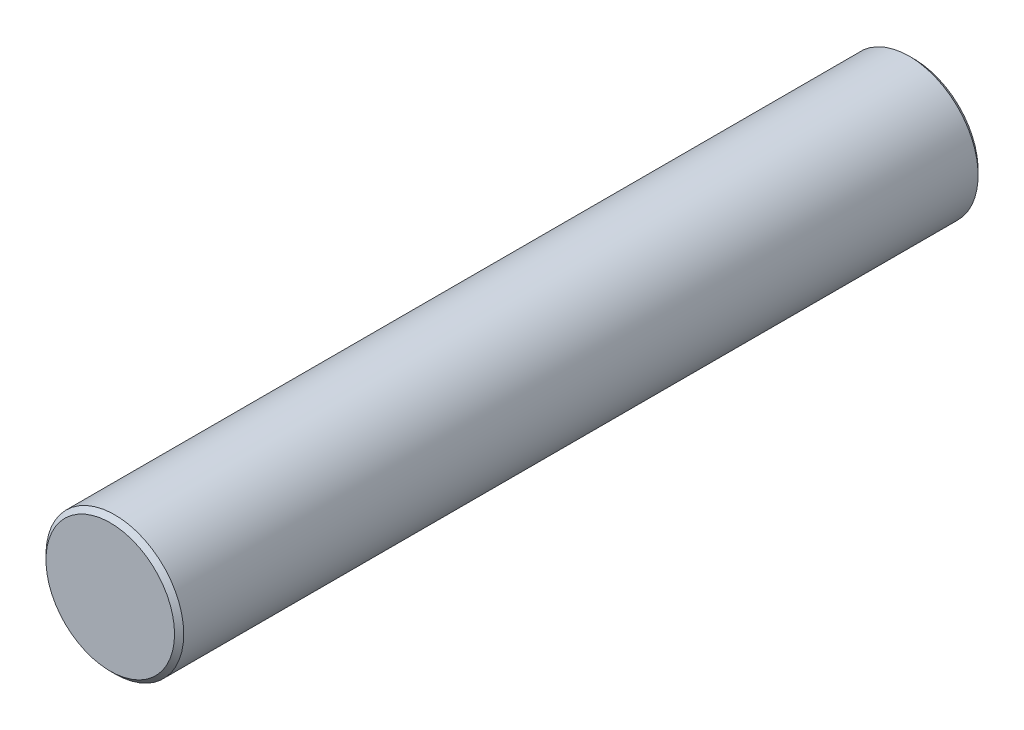
ISO-10303-21;
HEADER;
FILE_DESCRIPTION(('STEP AP214'),'2;1');
FILE_NAME('part.step','',(''),(''),'','','');
FILE_SCHEMA(('AUTOMOTIVE_DESIGN { 1 0 10303 214 1 1 1 1 }'));
ENDSEC;
DATA;
#1=APPLICATION_CONTEXT('core data for automotive mechanical design processes');
#2=APPLICATION_PROTOCOL_DEFINITION('international standard','automotive_design',2000,#1);
#3=PRODUCT_CONTEXT('',#1,'mechanical');
#4=PRODUCT('Part','Part','',(#3));
#5=PRODUCT_RELATED_PRODUCT_CATEGORY('part','',(#4));
#6=PRODUCT_DEFINITION_FORMATION('','',#4);
#7=PRODUCT_DEFINITION_CONTEXT('part definition',#1,'design');
#8=PRODUCT_DEFINITION('design','',#6,#7);
#9=PRODUCT_DEFINITION_SHAPE('','',#8);
#10=(LENGTH_UNIT() NAMED_UNIT(*) SI_UNIT(.MILLI.,.METRE.));
#11=(NAMED_UNIT(*) PLANE_ANGLE_UNIT() SI_UNIT($,.RADIAN.));
#12=(NAMED_UNIT(*) SI_UNIT($,.STERADIAN.) SOLID_ANGLE_UNIT());
#13=UNCERTAINTY_MEASURE_WITH_UNIT(LENGTH_MEASURE(1.E-05),#10,'distance_accuracy_value','');
#14=(GEOMETRIC_REPRESENTATION_CONTEXT(3) GLOBAL_UNCERTAINTY_ASSIGNED_CONTEXT((#13)) GLOBAL_UNIT_ASSIGNED_CONTEXT((#10,
#11,#12)) REPRESENTATION_CONTEXT('',''));
#15=CARTESIAN_POINT('',(0.,0.,0.));
#16=DIRECTION('',(0.,0.,1.));
#17=DIRECTION('',(1.,0.,0.));
#18=AXIS2_PLACEMENT_3D('',#15,#16,#17);
#19=CARTESIAN_POINT('',(0.,0.,35.));
#20=DIRECTION('',(0.,0.,-1.));
#21=DIRECTION('',(-1.,0.,0.));
#22=AXIS2_PLACEMENT_3D('',#19,#20,#21);
#23=CYLINDRICAL_SURFACE('',#22,3.);
#24=CARTESIAN_POINT('',(0.,0.,34.8));
#25=DIRECTION('',(0.,0.,1.));
#26=DIRECTION('',(1.,0.,0.));
#27=AXIS2_PLACEMENT_3D('',#24,#25,#26);
#28=CIRCLE('',#27,3.);
#29=CARTESIAN_POINT('',(3.,0.,34.8));
#30=VERTEX_POINT('',#29);
#31=EDGE_CURVE('E110',#30,#30,#28,.F.);
#32=ORIENTED_EDGE('',*,*,#31,.T.);
#33=EDGE_LOOP('',(#32));
#34=FACE_BOUND('',#33,.T.);
#35=CARTESIAN_POINT('',(0.,0.,10.2));
#36=DIRECTION('',(0.,0.,1.));
#37=DIRECTION('',(1.,0.,0.));
#38=AXIS2_PLACEMENT_3D('',#35,#36,#37);
#39=CIRCLE('',#38,3.);
#40=CARTESIAN_POINT('',(-2.,2.23606797749979,10.2));
#41=VERTEX_POINT('',#40);
#42=CARTESIAN_POINT('',(-2.,-2.23606797749979,10.2));
#43=VERTEX_POINT('',#42);
#44=EDGE_CURVE('E93',#41,#43,#39,.T.);
#45=ORIENTED_EDGE('',*,*,#44,.T.);
#46=DIRECTION('',(0.,0.,-1.));
#47=VECTOR('',#46,1.);
#48=CARTESIAN_POINT('',(-2.,-2.23606797749979,35.));
#49=LINE('',#48,#47);
#50=CARTESIAN_POINT('',(-2.,-2.23606797749979,0.199999999999999));
#51=VERTEX_POINT('',#50);
#52=EDGE_CURVE('E89',#51,#43,#49,.F.);
#53=ORIENTED_EDGE('',*,*,#52,.F.);
#54=CARTESIAN_POINT('',(0.,0.,0.199999999999999));
#55=DIRECTION('',(0.,0.,1.));
#56=DIRECTION('',(1.,0.,0.));
#57=AXIS2_PLACEMENT_3D('',#54,#55,#56);
#58=CIRCLE('',#57,3.);
#59=CARTESIAN_POINT('',(-2.,2.23606797749979,0.199999999999999));
#60=VERTEX_POINT('',#59);
#61=EDGE_CURVE('E85',#51,#60,#58,.T.);
#62=ORIENTED_EDGE('',*,*,#61,.T.);
#63=DIRECTION('',(0.,0.,-1.));
#64=VECTOR('',#63,1.);
#65=CARTESIAN_POINT('',(-2.,2.23606797749979,35.));
#66=LINE('',#65,#64);
#67=EDGE_CURVE('E88',#41,#60,#66,.T.);
#68=ORIENTED_EDGE('',*,*,#67,.F.);
#69=EDGE_LOOP('',(#45,#53,#62,#68));
#70=FACE_BOUND('',#69,.T.);
#71=ADVANCED_FACE('F37',(#34,#70),#23,.T.);
#72=CARTESIAN_POINT('',(0.,0.,0.));
#73=DIRECTION('',(0.,0.,1.));
#74=DIRECTION('',(1.,0.,0.));
#75=AXIS2_PLACEMENT_3D('',#72,#73,#74);
#76=PLANE('',#75);
#77=CARTESIAN_POINT('',(0.,0.,0.));
#78=DIRECTION('',(0.,0.,-1.));
#79=DIRECTION('',(-1.,0.,0.));
#80=AXIS2_PLACEMENT_3D('',#77,#78,#79);
#81=CIRCLE('',#80,0.3);
#82=CARTESIAN_POINT('',(-0.3,0.,0.));
#83=VERTEX_POINT('',#82);
#84=EDGE_CURVE('E172',#83,#83,#81,.T.);
#85=ORIENTED_EDGE('',*,*,#84,.F.);
#86=EDGE_LOOP('',(#85));
#87=FACE_BOUND('',#86,.T.);
#88=CARTESIAN_POINT('',(0.,0.,0.));
#89=DIRECTION('',(0.,0.,1.));
#90=DIRECTION('',(1.,0.,0.));
#91=AXIS2_PLACEMENT_3D('',#88,#89,#90);
#92=CIRCLE('',#91,2.8);
#93=CARTESIAN_POINT('',(-1.8,2.14476105895273,0.));
#94=VERTEX_POINT('',#93);
#95=CARTESIAN_POINT('',(-1.8,-2.14476105895273,0.));
#96=VERTEX_POINT('',#95);
#97=EDGE_CURVE('E58',#94,#96,#92,.F.);
#98=ORIENTED_EDGE('',*,*,#97,.T.);
#99=DIRECTION('',(0.,1.,0.));
#100=VECTOR('',#99,1.);
#101=CARTESIAN_POINT('',(-1.8,2.23606797749979,0.));
#102=LINE('',#101,#100);
#103=EDGE_CURVE('E108',#96,#94,#102,.T.);
#104=ORIENTED_EDGE('',*,*,#103,.T.);
#105=EDGE_LOOP('',(#98,#104));
#106=FACE_BOUND('',#105,.T.);
#107=ADVANCED_FACE('F143',(#87,#106),#76,.F.);
#108=CARTESIAN_POINT('',(0.,0.,35.));
#109=DIRECTION('',(0.,0.,1.));
#110=DIRECTION('',(1.,0.,0.));
#111=AXIS2_PLACEMENT_3D('',#108,#109,#110);
#112=PLANE('',#111);
#113=CARTESIAN_POINT('',(0.,0.,35.));
#114=DIRECTION('',(0.,0.,1.));
#115=DIRECTION('',(1.,0.,0.));
#116=AXIS2_PLACEMENT_3D('',#113,#114,#115);
#117=CIRCLE('',#116,2.8);
#118=CARTESIAN_POINT('',(2.8,0.,35.));
#119=VERTEX_POINT('',#118);
#120=EDGE_CURVE('E94',#119,#119,#117,.T.);
#121=ORIENTED_EDGE('',*,*,#120,.T.);
#122=EDGE_LOOP('',(#121));
#123=FACE_BOUND('',#122,.T.);
#124=ADVANCED_FACE('F139',(#123),#112,.T.);
#125=CARTESIAN_POINT('',(-2.,3.,10.));
#126=DIRECTION('',(0.,0.,1.));
#127=DIRECTION('',(0.,-1.,0.));
#128=AXIS2_PLACEMENT_3D('',#125,#126,#127);
#129=PLANE('',#128);
#130=DIRECTION('',(0.,1.,0.));
#131=VECTOR('',#130,1.);
#132=CARTESIAN_POINT('',(-2.,3.,10.));
#133=LINE('',#132,#131);
#134=CARTESIAN_POINT('',(-2.,-1.95959179422655,10.));
#135=VERTEX_POINT('',#134);
#136=CARTESIAN_POINT('',(-2.,1.95959179422655,10.));
#137=VERTEX_POINT('',#136);
#138=EDGE_CURVE('E104',#135,#137,#133,.T.);
#139=ORIENTED_EDGE('',*,*,#138,.F.);
#140=CARTESIAN_POINT('',(0.,0.,10.));
#141=DIRECTION('',(0.,0.,1.));
#142=DIRECTION('',(0.,-1.,0.));
#143=AXIS2_PLACEMENT_3D('',#140,#141,#142);
#144=CIRCLE('',#143,2.8);
#145=EDGE_CURVE('E106',#135,#137,#144,.F.);
#146=ORIENTED_EDGE('',*,*,#145,.T.);
#147=EDGE_LOOP('',(#139,#146));
#148=FACE_BOUND('',#147,.T.);
#149=ADVANCED_FACE('F133',(#148),#129,.F.);
#150=CARTESIAN_POINT('',(-2.,-3.,10.));
#151=DIRECTION('',(-1.,0.,0.));
#152=DIRECTION('',(0.,0.,1.));
#153=AXIS2_PLACEMENT_3D('',#150,#151,#152);
#154=PLANE('',#153);
#155=ORIENTED_EDGE('',*,*,#67,.T.);
#156=DIRECTION('',(0.,-1.,0.));
#157=VECTOR('',#156,1.);
#158=CARTESIAN_POINT('',(-2.,-2.23606797749979,0.199999999999999));
#159=LINE('',#158,#157);
#160=EDGE_CURVE('E98',#60,#51,#159,.T.);
#161=ORIENTED_EDGE('',*,*,#160,.T.);
#162=ORIENTED_EDGE('',*,*,#52,.T.);
#163=CARTESIAN_POINT('',(-2.,-2.23606797749979,10.2));
#164=CARTESIAN_POINT('',(-2.,-2.19048598141273,10.1659793012056));
#165=CARTESIAN_POINT('',(-2.,-2.14465534613363,10.1323023164751));
#166=CARTESIAN_POINT('',(-2.,-2.05249662028503,10.0656356471692));
#167=CARTESIAN_POINT('',(-2.,-2.00616852780638,10.0326459652331));
#168=CARTESIAN_POINT('',(-2.,-1.95959179422656,9.99999999999999));
#169=B_SPLINE_CURVE_WITH_KNOTS('',3,(#163,#164,#165,#166,#167,#168),.UNSPECIFIED.,.F.,.F.,(4,2,
4),(0.,0.17062027392918,0.341241202899176),.UNSPECIFIED.);
#170=EDGE_CURVE('E51',#43,#135,#169,.T.);
#171=ORIENTED_EDGE('',*,*,#170,.T.);
#172=ORIENTED_EDGE('',*,*,#138,.T.);
#173=CARTESIAN_POINT('',(-2.,1.95959179422655,10.));
#174=CARTESIAN_POINT('',(-2.,2.00616852780638,10.0326459652331));
#175=CARTESIAN_POINT('',(-2.,2.05249662028503,10.0656356471692));
#176=CARTESIAN_POINT('',(-2.,2.14465534613363,10.132302316475));
#177=CARTESIAN_POINT('',(-2.,2.19048598141273,10.1659793012056));
#178=CARTESIAN_POINT('',(-2.,2.23606797749979,10.2));
#179=B_SPLINE_CURVE_WITH_KNOTS('',3,(#173,#174,#175,#176,#177,#178),.UNSPECIFIED.,.F.,.F.,(4,2,
4),(0.,0.170620928969998,0.341241202899177),.UNSPECIFIED.);
#180=EDGE_CURVE('E11',#137,#41,#179,.T.);
#181=ORIENTED_EDGE('',*,*,#180,.T.);
#182=EDGE_LOOP('',(#155,#161,#162,#171,#172,#181));
#183=FACE_BOUND('',#182,.T.);
#184=ADVANCED_FACE('F97',(#183),#154,.T.);
#185=CARTESIAN_POINT('',(0.,0.,35.));
#186=DIRECTION('',(0.,0.,-1.));
#187=DIRECTION('',(-1.,0.,0.));
#188=AXIS2_PLACEMENT_3D('',#185,#186,#187);
#189=CONICAL_SURFACE('',#188,2.8,0.785398163397448);
#190=ORIENTED_EDGE('',*,*,#31,.F.);
#191=EDGE_LOOP('',(#190));
#192=FACE_BOUND('',#191,.T.);
#193=ORIENTED_EDGE('',*,*,#120,.F.);
#194=EDGE_LOOP('',(#193));
#195=FACE_BOUND('',#194,.T.);
#196=ADVANCED_FACE('F132',(#192,#195),#189,.T.);
#197=CARTESIAN_POINT('',(0.,0.,10.2));
#198=DIRECTION('',(0.,0.,1.));
#199=DIRECTION('',(1.,0.,0.));
#200=AXIS2_PLACEMENT_3D('',#197,#198,#199);
#201=CONICAL_SURFACE('',#200,3.,0.785398163397448);
#202=ORIENTED_EDGE('',*,*,#180,.F.);
#203=ORIENTED_EDGE('',*,*,#145,.F.);
#204=ORIENTED_EDGE('',*,*,#170,.F.);
#205=ORIENTED_EDGE('',*,*,#44,.F.);
#206=EDGE_LOOP('',(#202,#203,#204,#205));
#207=FACE_BOUND('',#206,.T.);
#208=ADVANCED_FACE('F125',(#207),#201,.T.);
#209=CARTESIAN_POINT('',(0.,0.,0.199999999999999));
#210=DIRECTION('',(0.,0.,1.));
#211=DIRECTION('',(1.,0.,0.));
#212=AXIS2_PLACEMENT_3D('',#209,#210,#211);
#213=CONICAL_SURFACE('',#212,3.,0.785398163397448);
#214=CARTESIAN_POINT('',(-2.,-2.23606797749979,0.199999999999999));
#215=CARTESIAN_POINT('',(-1.96660111532568,-2.22113737857251,0.166601115325682));
#216=CARTESIAN_POINT('',(-1.93323501164605,-2.20606317171138,0.133235011646052));
#217=CARTESIAN_POINT('',(-1.86656834493741,-2.17562753237957,0.0665683449374142));
#218=CARTESIAN_POINT('',(-1.83326778195038,-2.16026609972501,0.0332677819503773));
#219=CARTESIAN_POINT('',(-1.8,-2.14476105895275,0.));
#220=B_SPLINE_CURVE_WITH_KNOTS('',3,(#214,#215,#216,#217,#218,#219),.UNSPECIFIED.,.F.,.F.,(4,2,
4),(0.,0.148608307836759,0.297216710807013),.UNSPECIFIED.);
#221=EDGE_CURVE('E105',#96,#51,#220,.F.);
#222=ORIENTED_EDGE('',*,*,#221,.F.);
#223=ORIENTED_EDGE('',*,*,#97,.F.);
#224=CARTESIAN_POINT('',(-1.8,2.14476105895273,0.));
#225=CARTESIAN_POINT('',(-1.83326778195038,2.160266099725,0.0332677819503797));
#226=CARTESIAN_POINT('',(-1.86656834493742,2.17562753237956,0.0665683449374155));
#227=CARTESIAN_POINT('',(-1.93323501164605,2.20606317171139,0.13323501164605));
#228=CARTESIAN_POINT('',(-1.96660111532568,2.22113737857253,0.166601115325678));
#229=CARTESIAN_POINT('',(-1.99999999999999,2.23606797749982,0.199999999999992));
#230=B_SPLINE_CURVE_WITH_KNOTS('',3,(#224,#225,#226,#227,#228,#229),.UNSPECIFIED.,.F.,.F.,(4,2,
4),(0.,0.148608402970253,0.297216710807013),.UNSPECIFIED.);
#231=EDGE_CURVE('E42',#60,#94,#230,.F.);
#232=ORIENTED_EDGE('',*,*,#231,.F.);
#233=ORIENTED_EDGE('',*,*,#61,.F.);
#234=EDGE_LOOP('',(#222,#223,#232,#233));
#235=FACE_BOUND('',#234,.T.);
#236=ADVANCED_FACE('F103',(#235),#213,.T.);
#237=CARTESIAN_POINT('',(-2.,-3.,0.199999999999999));
#238=DIRECTION('',(-0.707106781186548,0.,-0.707106781186548));
#239=DIRECTION('',(-0.707106781186548,0.,0.707106781186548));
#240=AXIS2_PLACEMENT_3D('',#237,#238,#239);
#241=PLANE('',#240);
#242=ORIENTED_EDGE('',*,*,#231,.T.);
#243=ORIENTED_EDGE('',*,*,#103,.F.);
#244=ORIENTED_EDGE('',*,*,#221,.T.);
#245=ORIENTED_EDGE('',*,*,#160,.F.);
#246=EDGE_LOOP('',(#242,#243,#244,#245));
#247=FACE_BOUND('',#246,.T.);
#248=ADVANCED_FACE('F39',(#247),#241,.T.);
#249=CARTESIAN_POINT('',(0.,0.,0.));
#250=DIRECTION('',(0.,0.,-1.));
#251=DIRECTION('',(-1.,0.,0.));
#252=AXIS2_PLACEMENT_3D('',#249,#250,#251);
#253=CONICAL_SURFACE('',#252,0.3,0.261799387799149);
#254=CARTESIAN_POINT('',(0.,0.,0.4));
#255=DIRECTION('',(0.,0.,-1.));
#256=DIRECTION('',(-1.,0.,0.));
#257=AXIS2_PLACEMENT_3D('',#254,#255,#256);
#258=CIRCLE('',#257,0.192820323027551);
#259=CARTESIAN_POINT('',(-0.192820323027551,0.,0.4));
#260=VERTEX_POINT('',#259);
#261=EDGE_CURVE('E169',#260,#260,#258,.T.);
#262=ORIENTED_EDGE('',*,*,#261,.F.);
#263=EDGE_LOOP('',(#262));
#264=FACE_BOUND('',#263,.T.);
#265=ORIENTED_EDGE('',*,*,#84,.T.);
#266=EDGE_LOOP('',(#265));
#267=FACE_BOUND('',#266,.T.);
#268=ADVANCED_FACE('F134',(#264,#267),#253,.F.);
#269=CARTESIAN_POINT('',(0.,0.,0.4));
#270=DIRECTION('',(0.,0.,-1.));
#271=DIRECTION('',(-1.,0.,0.));
#272=AXIS2_PLACEMENT_3D('',#269,#270,#271);
#273=PLANE('',#272);
#274=ORIENTED_EDGE('',*,*,#261,.T.);
#275=EDGE_LOOP('',(#274));
#276=FACE_BOUND('',#275,.T.);
#277=ADVANCED_FACE('F177',(#276),#273,.T.);
#278=CLOSED_SHELL('',(#71,#107,#124,#149,#184,#196,#208,#236,#248,#268,#277));
#279=MANIFOLD_SOLID_BREP('B2',#278);
#280=ADVANCED_BREP_SHAPE_REPRESENTATION('',(#18,#279),#14);
#281=SHAPE_DEFINITION_REPRESENTATION(#9,#280);
ENDSEC;
END-ISO-10303-21;
